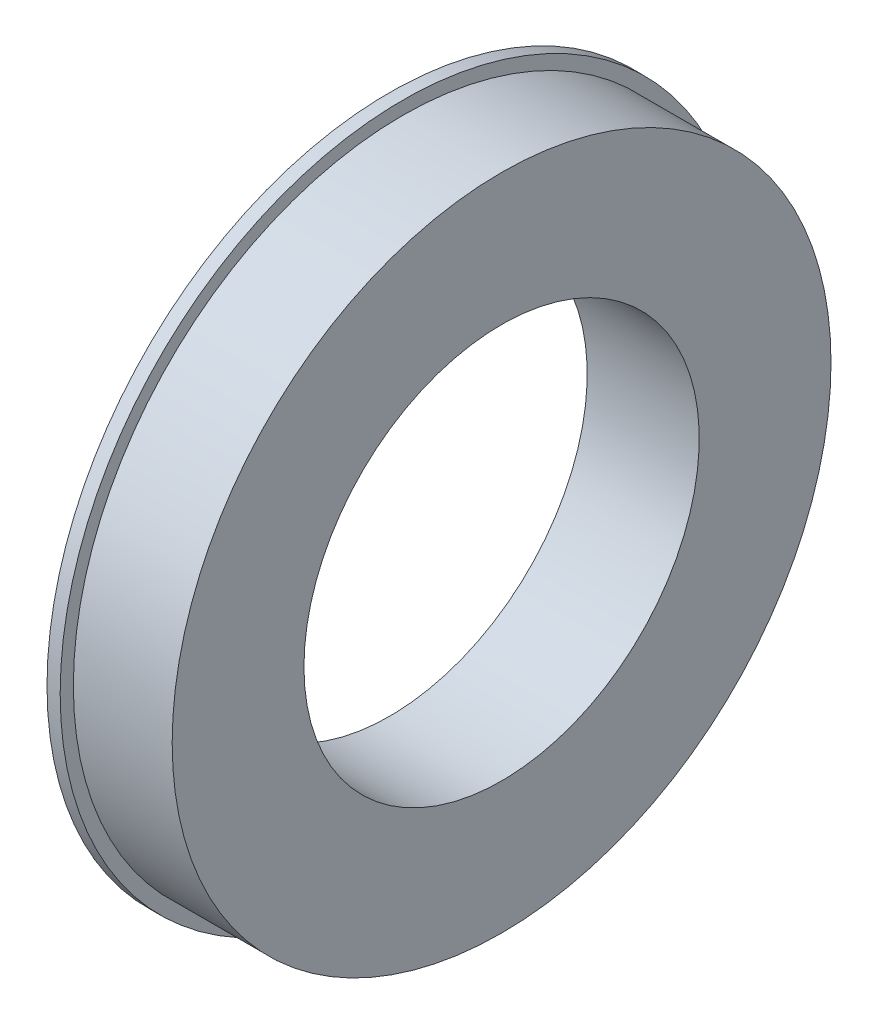
ISO-10303-21;
HEADER;
FILE_DESCRIPTION(('STEP AP214'),'2;1');
FILE_NAME('part.step','',(''),(''),'','','');
FILE_SCHEMA(('AUTOMOTIVE_DESIGN { 1 0 10303 214 1 1 1 1 }'));
ENDSEC;
DATA;
#1=APPLICATION_CONTEXT('core data for automotive mechanical design processes');
#2=APPLICATION_PROTOCOL_DEFINITION('international standard','automotive_design',2000,#1);
#3=PRODUCT_CONTEXT('',#1,'mechanical');
#4=PRODUCT('Part','Part','',(#3));
#5=PRODUCT_RELATED_PRODUCT_CATEGORY('part','',(#4));
#6=PRODUCT_DEFINITION_FORMATION('','',#4);
#7=PRODUCT_DEFINITION_CONTEXT('part definition',#1,'design');
#8=PRODUCT_DEFINITION('design','',#6,#7);
#9=PRODUCT_DEFINITION_SHAPE('','',#8);
#10=(LENGTH_UNIT() NAMED_UNIT(*) SI_UNIT(.MILLI.,.METRE.));
#11=(NAMED_UNIT(*) PLANE_ANGLE_UNIT() SI_UNIT($,.RADIAN.));
#12=(NAMED_UNIT(*) SI_UNIT($,.STERADIAN.) SOLID_ANGLE_UNIT());
#13=UNCERTAINTY_MEASURE_WITH_UNIT(LENGTH_MEASURE(1.E-05),#10,'distance_accuracy_value','');
#14=(GEOMETRIC_REPRESENTATION_CONTEXT(3) GLOBAL_UNCERTAINTY_ASSIGNED_CONTEXT((#13)) GLOBAL_UNIT_ASSIGNED_CONTEXT((#10,
#11,#12)) REPRESENTATION_CONTEXT('',''));
#15=CARTESIAN_POINT('',(0.,0.,0.));
#16=DIRECTION('',(0.,0.,1.));
#17=DIRECTION('',(1.,0.,0.));
#18=AXIS2_PLACEMENT_3D('',#15,#16,#17);
#19=CARTESIAN_POINT('',(19.05,0.,0.));
#20=DIRECTION('',(1.,0.,0.));
#21=DIRECTION('',(0.,0.,-1.));
#22=AXIS2_PLACEMENT_3D('',#19,#20,#21);
#23=PLANE('',#22);
#24=CARTESIAN_POINT('',(19.05,0.,0.));
#25=DIRECTION('',(1.,0.,0.));
#26=DIRECTION('',(0.,0.,-1.));
#27=AXIS2_PLACEMENT_3D('',#24,#25,#26);
#28=CIRCLE('',#27,63.5);
#29=CARTESIAN_POINT('',(19.05,0.,63.5));
#30=VERTEX_POINT('',#29);
#31=EDGE_CURVE('E10',#30,#30,#28,.T.);
#32=ORIENTED_EDGE('',*,*,#31,.T.);
#33=EDGE_LOOP('',(#32));
#34=FACE_BOUND('',#33,.T.);
#35=CARTESIAN_POINT('',(19.05,0.,0.));
#36=DIRECTION('',(1.,0.,0.));
#37=DIRECTION('',(0.,0.,-1.));
#38=AXIS2_PLACEMENT_3D('',#35,#36,#37);
#39=CIRCLE('',#38,38.1);
#40=CARTESIAN_POINT('',(19.05,0.,38.1));
#41=VERTEX_POINT('',#40);
#42=EDGE_CURVE('E52',#41,#41,#39,.T.);
#43=ORIENTED_EDGE('',*,*,#42,.F.);
#44=EDGE_LOOP('',(#43));
#45=FACE_BOUND('',#44,.T.);
#46=ADVANCED_FACE('F43',(#34,#45),#23,.T.);
#47=CARTESIAN_POINT('',(19.05,0.,0.));
#48=DIRECTION('',(-1.,0.,0.));
#49=DIRECTION('',(0.,0.,1.));
#50=AXIS2_PLACEMENT_3D('',#47,#48,#49);
#51=CYLINDRICAL_SURFACE('',#50,63.5);
#52=CARTESIAN_POINT('',(0.,0.,0.));
#53=DIRECTION('',(1.,0.,0.));
#54=DIRECTION('',(0.,0.,-1.));
#55=AXIS2_PLACEMENT_3D('',#52,#53,#54);
#56=CIRCLE('',#55,63.5);
#57=CARTESIAN_POINT('',(0.,0.,63.5));
#58=VERTEX_POINT('',#57);
#59=EDGE_CURVE('E47',#58,#58,#56,.T.);
#60=CARTESIAN_POINT('',(19.05,0.,63.5));
#61=CARTESIAN_POINT('',(18.8515625,0.,63.5));
#62=CARTESIAN_POINT('',(18.653125,0.,63.5));
#63=CARTESIAN_POINT('',(18.25625,0.,63.5));
#64=CARTESIAN_POINT('',(18.0578125,0.,63.5));
#65=CARTESIAN_POINT('',(17.6609375,0.,63.5));
#66=CARTESIAN_POINT('',(17.4625,0.,63.5));
#67=CARTESIAN_POINT('',(17.065625,0.,63.5));
#68=CARTESIAN_POINT('',(16.8671875,0.,63.5));
#69=CARTESIAN_POINT('',(16.4703125,0.,63.5));
#70=CARTESIAN_POINT('',(16.271875,0.,63.5));
#71=CARTESIAN_POINT('',(15.875,0.,63.5));
#72=CARTESIAN_POINT('',(15.6765625,0.,63.5));
#73=CARTESIAN_POINT('',(15.2796875,0.,63.5));
#74=CARTESIAN_POINT('',(15.08125,0.,63.5));
#75=CARTESIAN_POINT('',(14.684375,0.,63.5));
#76=CARTESIAN_POINT('',(14.4859375,0.,63.5));
#77=CARTESIAN_POINT('',(14.0890625,0.,63.5));
#78=CARTESIAN_POINT('',(13.890625,0.,63.5));
#79=CARTESIAN_POINT('',(13.49375,0.,63.5));
#80=CARTESIAN_POINT('',(13.2953125,0.,63.5));
#81=CARTESIAN_POINT('',(12.8984375,0.,63.5));
#82=CARTESIAN_POINT('',(12.7,0.,63.5));
#83=CARTESIAN_POINT('',(12.303125,0.,63.5));
#84=CARTESIAN_POINT('',(12.1046875,0.,63.5));
#85=CARTESIAN_POINT('',(11.7078125,0.,63.5));
#86=CARTESIAN_POINT('',(11.509375,0.,63.5));
#87=CARTESIAN_POINT('',(11.1125,0.,63.5));
#88=CARTESIAN_POINT('',(10.9140625,0.,63.5));
#89=CARTESIAN_POINT('',(10.5171875,0.,63.5));
#90=CARTESIAN_POINT('',(10.31875,0.,63.5));
#91=CARTESIAN_POINT('',(9.921875,0.,63.5));
#92=CARTESIAN_POINT('',(9.7234375,0.,63.5));
#93=CARTESIAN_POINT('',(9.3265625,0.,63.5));
#94=CARTESIAN_POINT('',(9.128125,0.,63.5));
#95=CARTESIAN_POINT('',(8.73125,0.,63.5));
#96=CARTESIAN_POINT('',(8.5328125,0.,63.5));
#97=CARTESIAN_POINT('',(8.1359375,0.,63.5));
#98=CARTESIAN_POINT('',(7.9375,0.,63.5));
#99=CARTESIAN_POINT('',(7.540625,0.,63.5));
#100=CARTESIAN_POINT('',(7.3421875,0.,63.5));
#101=CARTESIAN_POINT('',(6.9453125,0.,63.5));
#102=CARTESIAN_POINT('',(6.746875,0.,63.5));
#103=CARTESIAN_POINT('',(6.35,0.,63.5));
#104=CARTESIAN_POINT('',(6.1515625,0.,63.5));
#105=CARTESIAN_POINT('',(5.7546875,0.,63.5));
#106=CARTESIAN_POINT('',(5.55625,0.,63.5));
#107=CARTESIAN_POINT('',(5.159375,0.,63.5));
#108=CARTESIAN_POINT('',(4.9609375,0.,63.5));
#109=CARTESIAN_POINT('',(4.5640625,0.,63.5));
#110=CARTESIAN_POINT('',(4.365625,0.,63.5));
#111=CARTESIAN_POINT('',(3.96875,0.,63.5));
#112=CARTESIAN_POINT('',(3.7703125,0.,63.5));
#113=CARTESIAN_POINT('',(3.3734375,0.,63.5));
#114=CARTESIAN_POINT('',(3.175,0.,63.5));
#115=CARTESIAN_POINT('',(2.778125,0.,63.5));
#116=CARTESIAN_POINT('',(2.5796875,0.,63.5));
#117=CARTESIAN_POINT('',(2.1828125,0.,63.5));
#118=CARTESIAN_POINT('',(1.984375,0.,63.5));
#119=CARTESIAN_POINT('',(1.5875,0.,63.5));
#120=CARTESIAN_POINT('',(1.3890625,0.,63.5));
#121=CARTESIAN_POINT('',(0.992187500000001,0.,63.5));
#122=CARTESIAN_POINT('',(0.793750000000001,0.,63.5));
#123=CARTESIAN_POINT('',(0.396875,0.,63.5));
#124=CARTESIAN_POINT('',(0.1984375,0.,63.5));
#125=CARTESIAN_POINT('',(0.,0.,63.5));
#126=B_SPLINE_CURVE_WITH_KNOTS('',3,(#60,#61,#62,#63,#64,#65,#66,#67,#68,#69,#70,#71,#72,#73,
#74,#75,#76,#77,#78,#79,#80,#81,#82,#83,#84,#85,#86,#87,#88,#89,#90,#91,#92,#93,#94,#95,#96,#97,
#98,#99,#100,#101,#102,#103,#104,#105,#106,#107,#108,#109,#110,#111,#112,#113,#114,#115,#116,
#117,#118,#119,#120,#121,#122,#123,#124,#125),.UNSPECIFIED.,.F.,.F.,(4,2,2,2,2,2,2,2,2,2,2,2,2,
2,2,2,2,2,2,2,2,2,2,2,2,2,2,2,2,2,2,2,4),(0.,0.5953125,1.190625,1.7859375,2.38125,2.9765625,
3.571875,4.1671875,4.7625,5.3578125,5.953125,6.5484375,7.14375,7.7390625,8.334375,8.9296875,
9.525,10.1203125,10.715625,11.3109375,11.90625,12.5015625,13.096875,13.6921875,14.2875,
14.8828125,15.478125,16.0734375,16.66875,17.2640625,17.859375,18.4546875,19.05),.UNSPECIFIED.);
#127=EDGE_CURVE('BSEAM45',#30,#58,#126,.T.);
#128=ORIENTED_EDGE('',*,*,#31,.F.);
#129=ORIENTED_EDGE('',*,*,#59,.T.);
#130=ORIENTED_EDGE('',*,*,#127,.T.);
#131=ORIENTED_EDGE('',*,*,#127,.F.);
#132=EDGE_LOOP('',(#128,#130,#129,#131));
#133=FACE_BOUND('',#132,.T.);
#134=ADVANCED_FACE('F45',(#133),#51,.T.);
#135=CARTESIAN_POINT('',(19.05,0.,0.));
#136=DIRECTION('',(-1.,0.,0.));
#137=DIRECTION('',(0.,0.,1.));
#138=AXIS2_PLACEMENT_3D('',#135,#136,#137);
#139=CYLINDRICAL_SURFACE('',#138,38.1);
#140=CARTESIAN_POINT('',(-2.54,0.,0.));
#141=DIRECTION('',(-1.,0.,0.));
#142=DIRECTION('',(0.,0.,1.));
#143=AXIS2_PLACEMENT_3D('',#140,#141,#142);
#144=CIRCLE('',#143,38.1);
#145=CARTESIAN_POINT('',(-2.54,0.,38.1));
#146=VERTEX_POINT('',#145);
#147=EDGE_CURVE('E64',#146,#146,#144,.T.);
#148=CARTESIAN_POINT('',(19.05,0.,38.1));
#149=CARTESIAN_POINT('',(18.8251041666667,0.,38.1));
#150=CARTESIAN_POINT('',(18.6002083333333,0.,38.1));
#151=CARTESIAN_POINT('',(18.1504166666667,0.,38.1));
#152=CARTESIAN_POINT('',(17.9255208333333,0.,38.1));
#153=CARTESIAN_POINT('',(17.4757291666667,0.,38.1));
#154=CARTESIAN_POINT('',(17.2508333333333,0.,38.1));
#155=CARTESIAN_POINT('',(16.8010416666667,0.,38.1));
#156=CARTESIAN_POINT('',(16.5761458333333,0.,38.1));
#157=CARTESIAN_POINT('',(16.1263541666667,0.,38.1));
#158=CARTESIAN_POINT('',(15.9014583333333,0.,38.1));
#159=CARTESIAN_POINT('',(15.4516666666667,0.,38.1));
#160=CARTESIAN_POINT('',(15.2267708333333,0.,38.1));
#161=CARTESIAN_POINT('',(14.7769791666667,0.,38.1));
#162=CARTESIAN_POINT('',(14.5520833333333,0.,38.1));
#163=CARTESIAN_POINT('',(14.1022916666667,0.,38.1));
#164=CARTESIAN_POINT('',(13.8773958333333,0.,38.1));
#165=CARTESIAN_POINT('',(13.4276041666667,0.,38.1));
#166=CARTESIAN_POINT('',(13.2027083333333,0.,38.1));
#167=CARTESIAN_POINT('',(12.7529166666667,0.,38.1));
#168=CARTESIAN_POINT('',(12.5280208333333,0.,38.1));
#169=CARTESIAN_POINT('',(12.0782291666667,0.,38.1));
#170=CARTESIAN_POINT('',(11.8533333333333,0.,38.1));
#171=CARTESIAN_POINT('',(11.4035416666667,0.,38.1));
#172=CARTESIAN_POINT('',(11.1786458333333,0.,38.1));
#173=CARTESIAN_POINT('',(10.7288541666667,0.,38.1));
#174=CARTESIAN_POINT('',(10.5039583333333,0.,38.1));
#175=CARTESIAN_POINT('',(10.0541666666667,0.,38.1));
#176=CARTESIAN_POINT('',(9.82927083333333,0.,38.1));
#177=CARTESIAN_POINT('',(9.37947916666667,0.,38.1));
#178=CARTESIAN_POINT('',(9.15458333333333,0.,38.1));
#179=CARTESIAN_POINT('',(8.70479166666667,0.,38.1));
#180=CARTESIAN_POINT('',(8.47989583333333,0.,38.1));
#181=CARTESIAN_POINT('',(8.03010416666667,0.,38.1));
#182=CARTESIAN_POINT('',(7.80520833333333,0.,38.1));
#183=CARTESIAN_POINT('',(7.35541666666667,0.,38.1));
#184=CARTESIAN_POINT('',(7.13052083333333,0.,38.1));
#185=CARTESIAN_POINT('',(6.68072916666667,0.,38.1));
#186=CARTESIAN_POINT('',(6.45583333333333,0.,38.1));
#187=CARTESIAN_POINT('',(6.00604166666667,0.,38.1));
#188=CARTESIAN_POINT('',(5.78114583333333,0.,38.1));
#189=CARTESIAN_POINT('',(5.33135416666667,0.,38.1));
#190=CARTESIAN_POINT('',(5.10645833333333,0.,38.1));
#191=CARTESIAN_POINT('',(4.65666666666667,0.,38.1));
#192=CARTESIAN_POINT('',(4.43177083333333,0.,38.1));
#193=CARTESIAN_POINT('',(3.98197916666667,0.,38.1));
#194=CARTESIAN_POINT('',(3.75708333333333,0.,38.1));
#195=CARTESIAN_POINT('',(3.30729166666667,0.,38.1));
#196=CARTESIAN_POINT('',(3.08239583333333,0.,38.1));
#197=CARTESIAN_POINT('',(2.63260416666667,0.,38.1));
#198=CARTESIAN_POINT('',(2.40770833333333,0.,38.1));
#199=CARTESIAN_POINT('',(1.95791666666667,0.,38.1));
#200=CARTESIAN_POINT('',(1.73302083333333,0.,38.1));
#201=CARTESIAN_POINT('',(1.28322916666667,0.,38.1));
#202=CARTESIAN_POINT('',(1.05833333333333,0.,38.1));
#203=CARTESIAN_POINT('',(0.608541666666666,0.,38.1));
#204=CARTESIAN_POINT('',(0.383645833333333,0.,38.1));
#205=CARTESIAN_POINT('',(-0.0661458333333342,0.,38.1));
#206=CARTESIAN_POINT('',(-0.291041666666668,0.,38.1));
#207=CARTESIAN_POINT('',(-0.740833333333334,0.,38.1));
#208=CARTESIAN_POINT('',(-0.965729166666667,0.,38.1));
#209=CARTESIAN_POINT('',(-1.41552083333333,0.,38.1));
#210=CARTESIAN_POINT('',(-1.64041666666667,0.,38.1));
#211=CARTESIAN_POINT('',(-2.09020833333333,0.,38.1));
#212=CARTESIAN_POINT('',(-2.31510416666667,0.,38.1));
#213=CARTESIAN_POINT('',(-2.54,0.,38.1));
#214=B_SPLINE_CURVE_WITH_KNOTS('',3,(#148,#149,#150,#151,#152,#153,#154,#155,#156,#157,#158,
#159,#160,#161,#162,#163,#164,#165,#166,#167,#168,#169,#170,#171,#172,#173,#174,#175,#176,#177,
#178,#179,#180,#181,#182,#183,#184,#185,#186,#187,#188,#189,#190,#191,#192,#193,#194,#195,#196,
#197,#198,#199,#200,#201,#202,#203,#204,#205,#206,#207,#208,#209,#210,#211,#212,#213),
.UNSPECIFIED.,.F.,.F.,(4,2,2,2,2,2,2,2,2,2,2,2,2,2,2,2,2,2,2,2,2,2,2,2,2,2,2,2,2,2,2,2,4),(0.,
0.6746875,1.349375,2.0240625,2.69875,3.3734375,4.048125,4.7228125,5.3975,6.0721875,6.746875,
7.4215625,8.09625,8.7709375,9.445625,10.1203125,10.795,11.4696875,12.144375,12.8190625,13.49375,
14.1684375,14.843125,15.5178125,16.1925,16.8671875,17.541875,18.2165625,18.89125,19.5659375,
20.240625,20.9153125,21.59),.UNSPECIFIED.);
#215=EDGE_CURVE('BSEAM72',#41,#146,#214,.T.);
#216=ORIENTED_EDGE('',*,*,#42,.T.);
#217=ORIENTED_EDGE('',*,*,#147,.T.);
#218=ORIENTED_EDGE('',*,*,#215,.T.);
#219=ORIENTED_EDGE('',*,*,#215,.F.);
#220=EDGE_LOOP('',(#216,#218,#217,#219));
#221=FACE_BOUND('',#220,.T.);
#222=ADVANCED_FACE('F72',(#221),#139,.F.);
#223=CARTESIAN_POINT('',(-2.54,0.,0.));
#224=DIRECTION('',(-1.,0.,0.));
#225=DIRECTION('',(0.,0.,1.));
#226=AXIS2_PLACEMENT_3D('',#223,#224,#225);
#227=PLANE('',#226);
#228=CARTESIAN_POINT('',(-2.54,0.,0.));
#229=DIRECTION('',(-1.,0.,0.));
#230=DIRECTION('',(0.,0.,1.));
#231=AXIS2_PLACEMENT_3D('',#228,#229,#230);
#232=CIRCLE('',#231,66.04);
#233=CARTESIAN_POINT('',(-2.54,0.,66.04));
#234=VERTEX_POINT('',#233);
#235=EDGE_CURVE('E63',#234,#234,#232,.T.);
#236=ORIENTED_EDGE('',*,*,#235,.T.);
#237=EDGE_LOOP('',(#236));
#238=FACE_BOUND('',#237,.T.);
#239=ORIENTED_EDGE('',*,*,#147,.F.);
#240=EDGE_LOOP('',(#239));
#241=FACE_BOUND('',#240,.T.);
#242=ADVANCED_FACE('F74',(#238,#241),#227,.T.);
#243=CARTESIAN_POINT('',(0.,0.,0.));
#244=DIRECTION('',(-1.,0.,0.));
#245=DIRECTION('',(0.,0.,1.));
#246=AXIS2_PLACEMENT_3D('',#243,#244,#245);
#247=PLANE('',#246);
#248=ORIENTED_EDGE('',*,*,#59,.F.);
#249=EDGE_LOOP('',(#248));
#250=FACE_BOUND('',#249,.T.);
#251=CARTESIAN_POINT('',(0.,0.,0.));
#252=DIRECTION('',(-1.,0.,0.));
#253=DIRECTION('',(0.,0.,1.));
#254=AXIS2_PLACEMENT_3D('',#251,#252,#253);
#255=CIRCLE('',#254,66.04);
#256=CARTESIAN_POINT('',(0.,0.,66.04));
#257=VERTEX_POINT('',#256);
#258=EDGE_CURVE('E59',#257,#257,#255,.T.);
#259=ORIENTED_EDGE('',*,*,#258,.F.);
#260=EDGE_LOOP('',(#259));
#261=FACE_BOUND('',#260,.T.);
#262=ADVANCED_FACE('F76',(#250,#261),#247,.F.);
#263=CARTESIAN_POINT('',(-2.54,0.,0.));
#264=DIRECTION('',(1.,0.,0.));
#265=DIRECTION('',(0.,0.,-1.));
#266=AXIS2_PLACEMENT_3D('',#263,#264,#265);
#267=CYLINDRICAL_SURFACE('',#266,66.04);
#268=ORIENTED_EDGE('',*,*,#235,.F.);
#269=EDGE_LOOP('',(#268));
#270=FACE_BOUND('',#269,.T.);
#271=ORIENTED_EDGE('',*,*,#258,.T.);
#272=EDGE_LOOP('',(#271));
#273=FACE_BOUND('',#272,.T.);
#274=ADVANCED_FACE('F83',(#270,#273),#267,.T.);
#275=CLOSED_SHELL('',(#46,#134,#222,#242,#262,#274));
#276=MANIFOLD_SOLID_BREP('B2',#275);
#277=ADVANCED_BREP_SHAPE_REPRESENTATION('',(#18,#276),#14);
#278=SHAPE_DEFINITION_REPRESENTATION(#9,#277);
ENDSEC;
END-ISO-10303-21;
